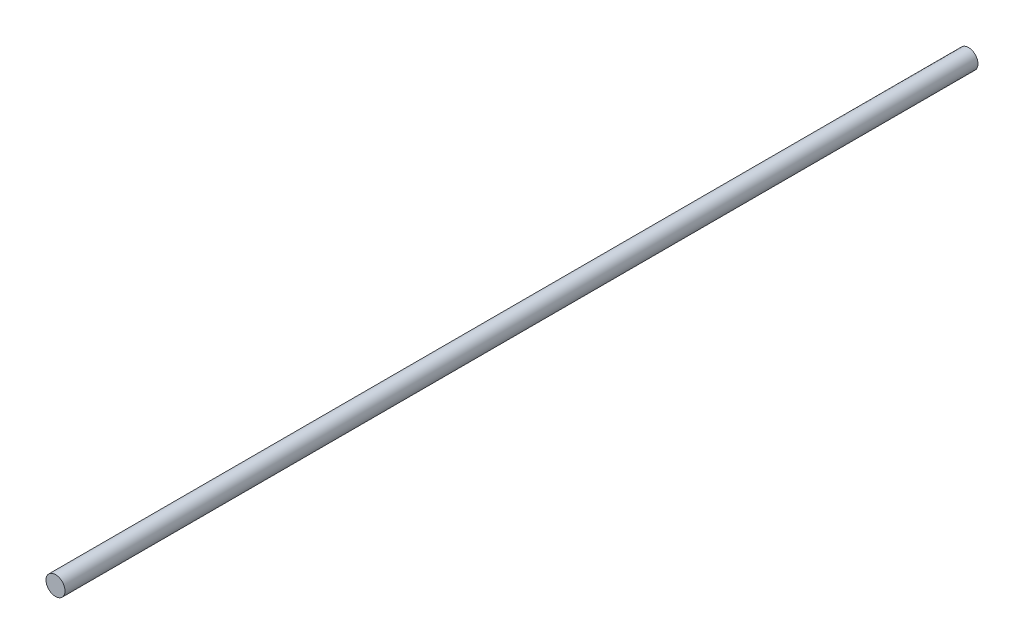
ISO-10303-21;
HEADER;
FILE_DESCRIPTION(('STEP AP214'),'2;1');
FILE_NAME('part.step','',(''),(''),'','','');
FILE_SCHEMA(('AUTOMOTIVE_DESIGN { 1 0 10303 214 1 1 1 1 }'));
ENDSEC;
DATA;
#1=APPLICATION_CONTEXT('core data for automotive mechanical design processes');
#2=APPLICATION_PROTOCOL_DEFINITION('international standard','automotive_design',2000,#1);
#3=PRODUCT_CONTEXT('',#1,'mechanical');
#4=PRODUCT('Part','Part','',(#3));
#5=PRODUCT_RELATED_PRODUCT_CATEGORY('part','',(#4));
#6=PRODUCT_DEFINITION_FORMATION('','',#4);
#7=PRODUCT_DEFINITION_CONTEXT('part definition',#1,'design');
#8=PRODUCT_DEFINITION('design','',#6,#7);
#9=PRODUCT_DEFINITION_SHAPE('','',#8);
#10=(LENGTH_UNIT() NAMED_UNIT(*) SI_UNIT(.MILLI.,.METRE.));
#11=(NAMED_UNIT(*) PLANE_ANGLE_UNIT() SI_UNIT($,.RADIAN.));
#12=(NAMED_UNIT(*) SI_UNIT($,.STERADIAN.) SOLID_ANGLE_UNIT());
#13=UNCERTAINTY_MEASURE_WITH_UNIT(LENGTH_MEASURE(1.E-05),#10,'distance_accuracy_value','');
#14=(GEOMETRIC_REPRESENTATION_CONTEXT(3) GLOBAL_UNCERTAINTY_ASSIGNED_CONTEXT((#13)) GLOBAL_UNIT_ASSIGNED_CONTEXT((#10,
#11,#12)) REPRESENTATION_CONTEXT('',''));
#15=CARTESIAN_POINT('',(0.,0.,0.));
#16=DIRECTION('',(0.,0.,1.));
#17=DIRECTION('',(1.,0.,0.));
#18=AXIS2_PLACEMENT_3D('',#15,#16,#17);
#19=CARTESIAN_POINT('',(0.,0.,192.));
#20=DIRECTION('',(0.,0.,-1.));
#21=DIRECTION('',(-1.,0.,0.));
#22=AXIS2_PLACEMENT_3D('',#19,#20,#21);
#23=CYLINDRICAL_SURFACE('',#22,2.);
#24=CARTESIAN_POINT('',(0.,0.,192.));
#25=DIRECTION('',(0.,0.,1.));
#26=DIRECTION('',(1.,0.,0.));
#27=AXIS2_PLACEMENT_3D('',#24,#25,#26);
#28=CIRCLE('',#27,2.);
#29=CARTESIAN_POINT('',(2.,0.,192.));
#30=VERTEX_POINT('',#29);
#31=EDGE_CURVE('E10',#30,#30,#28,.T.);
#32=ORIENTED_EDGE('',*,*,#31,.F.);
#33=EDGE_LOOP('',(#32));
#34=FACE_BOUND('',#33,.T.);
#35=CARTESIAN_POINT('',(0.,0.,0.));
#36=DIRECTION('',(0.,0.,1.));
#37=DIRECTION('',(1.,0.,0.));
#38=AXIS2_PLACEMENT_3D('',#35,#36,#37);
#39=CIRCLE('',#38,2.);
#40=CARTESIAN_POINT('',(2.,0.,0.));
#41=VERTEX_POINT('',#40);
#42=EDGE_CURVE('E34',#41,#41,#39,.T.);
#43=ORIENTED_EDGE('',*,*,#42,.T.);
#44=EDGE_LOOP('',(#43));
#45=FACE_BOUND('',#44,.T.);
#46=ADVANCED_FACE('F31',(#34,#45),#23,.T.);
#47=CARTESIAN_POINT('',(0.,0.,192.));
#48=DIRECTION('',(0.,0.,1.));
#49=DIRECTION('',(1.,0.,0.));
#50=AXIS2_PLACEMENT_3D('',#47,#48,#49);
#51=PLANE('',#50);
#52=ORIENTED_EDGE('',*,*,#31,.T.);
#53=EDGE_LOOP('',(#52));
#54=FACE_BOUND('',#53,.T.);
#55=ADVANCED_FACE('F46',(#54),#51,.T.);
#56=CARTESIAN_POINT('',(0.,0.,0.));
#57=DIRECTION('',(0.,0.,1.));
#58=DIRECTION('',(1.,0.,0.));
#59=AXIS2_PLACEMENT_3D('',#56,#57,#58);
#60=PLANE('',#59);
#61=ORIENTED_EDGE('',*,*,#42,.F.);
#62=EDGE_LOOP('',(#61));
#63=FACE_BOUND('',#62,.T.);
#64=ADVANCED_FACE('F44',(#63),#60,.F.);
#65=CLOSED_SHELL('',(#46,#55,#64));
#66=MANIFOLD_SOLID_BREP('B2',#65);
#67=ADVANCED_BREP_SHAPE_REPRESENTATION('',(#18,#66),#14);
#68=SHAPE_DEFINITION_REPRESENTATION(#9,#67);
ENDSEC;
END-ISO-10303-21;
